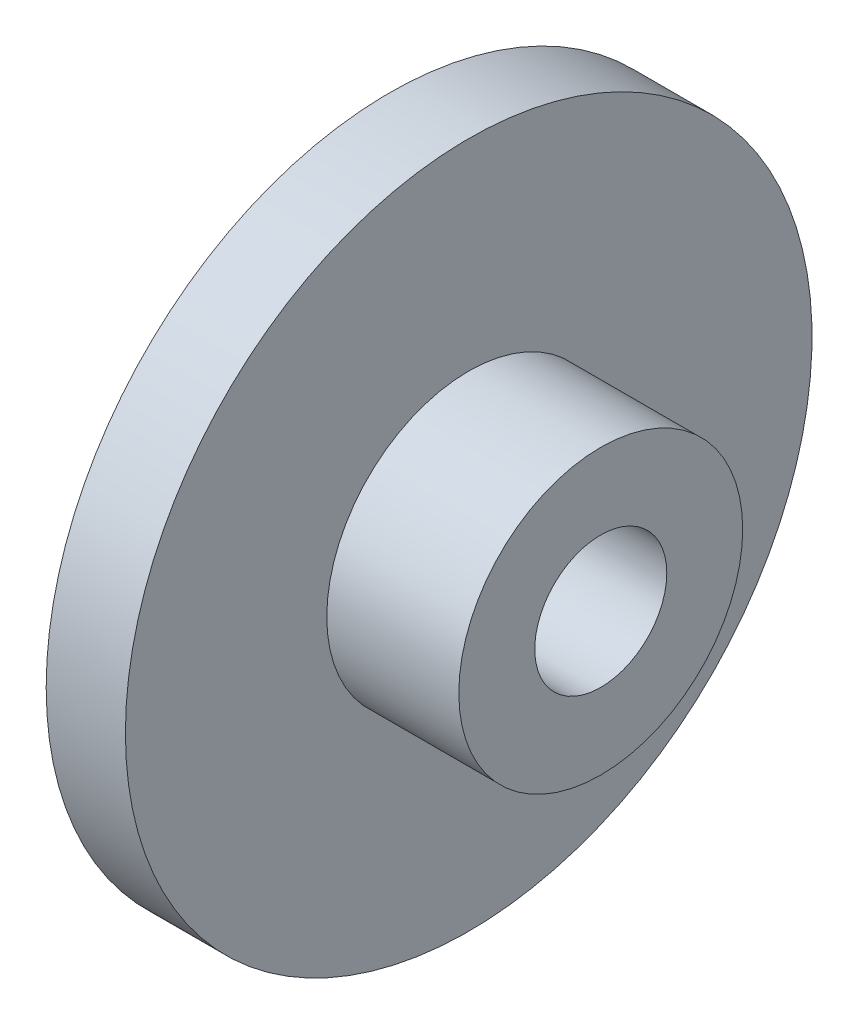
ISO-10303-21;
HEADER;
FILE_DESCRIPTION(('STEP AP214'),'2;1');
FILE_NAME('part.step','',(''),(''),'','','');
FILE_SCHEMA(('AUTOMOTIVE_DESIGN { 1 0 10303 214 1 1 1 1 }'));
ENDSEC;
DATA;
#1=APPLICATION_CONTEXT('core data for automotive mechanical design processes');
#2=APPLICATION_PROTOCOL_DEFINITION('international standard','automotive_design',2000,#1);
#3=PRODUCT_CONTEXT('',#1,'mechanical');
#4=PRODUCT('Part','Part','',(#3));
#5=PRODUCT_RELATED_PRODUCT_CATEGORY('part','',(#4));
#6=PRODUCT_DEFINITION_FORMATION('','',#4);
#7=PRODUCT_DEFINITION_CONTEXT('part definition',#1,'design');
#8=PRODUCT_DEFINITION('design','',#6,#7);
#9=PRODUCT_DEFINITION_SHAPE('','',#8);
#10=(LENGTH_UNIT() NAMED_UNIT(*) SI_UNIT(.MILLI.,.METRE.));
#11=(NAMED_UNIT(*) PLANE_ANGLE_UNIT() SI_UNIT($,.RADIAN.));
#12=(NAMED_UNIT(*) SI_UNIT($,.STERADIAN.) SOLID_ANGLE_UNIT());
#13=UNCERTAINTY_MEASURE_WITH_UNIT(LENGTH_MEASURE(1.E-05),#10,'distance_accuracy_value','');
#14=(GEOMETRIC_REPRESENTATION_CONTEXT(3) GLOBAL_UNCERTAINTY_ASSIGNED_CONTEXT((#13)) GLOBAL_UNIT_ASSIGNED_CONTEXT((#10,
#11,#12)) REPRESENTATION_CONTEXT('',''));
#15=CARTESIAN_POINT('',(0.,0.,0.));
#16=DIRECTION('',(0.,0.,1.));
#17=DIRECTION('',(1.,0.,0.));
#18=AXIS2_PLACEMENT_3D('',#15,#16,#17);
#19=CARTESIAN_POINT('',(4.7625,0.,0.));
#20=DIRECTION('',(1.,0.,0.));
#21=DIRECTION('',(0.,0.,-1.));
#22=AXIS2_PLACEMENT_3D('',#19,#20,#21);
#23=PLANE('',#22);
#24=CARTESIAN_POINT('',(4.7625,0.,0.));
#25=DIRECTION('',(1.,0.,0.));
#26=DIRECTION('',(0.,0.,-1.));
#27=AXIS2_PLACEMENT_3D('',#24,#25,#26);
#28=CIRCLE('',#27,20.6375);
#29=CARTESIAN_POINT('',(4.7625,0.,20.6375));
#30=VERTEX_POINT('',#29);
#31=EDGE_CURVE('E10',#30,#30,#28,.T.);
#32=ORIENTED_EDGE('',*,*,#31,.T.);
#33=EDGE_LOOP('',(#32));
#34=FACE_BOUND('',#33,.T.);
#35=CARTESIAN_POINT('',(4.7625,0.,0.));
#36=DIRECTION('',(1.,0.,0.));
#37=DIRECTION('',(0.,0.,-1.));
#38=AXIS2_PLACEMENT_3D('',#35,#36,#37);
#39=CIRCLE('',#38,8.5328125);
#40=CARTESIAN_POINT('',(4.7625,0.,-8.5328125));
#41=VERTEX_POINT('',#40);
#42=EDGE_CURVE('E45',#41,#41,#39,.T.);
#43=ORIENTED_EDGE('',*,*,#42,.F.);
#44=EDGE_LOOP('',(#43));
#45=FACE_BOUND('',#44,.T.);
#46=ADVANCED_FACE('F32',(#34,#45),#23,.T.);
#47=CARTESIAN_POINT('',(4.7625,0.,0.));
#48=DIRECTION('',(-1.,0.,0.));
#49=DIRECTION('',(0.,0.,1.));
#50=AXIS2_PLACEMENT_3D('',#47,#48,#49);
#51=CYLINDRICAL_SURFACE('',#50,20.6375);
#52=CARTESIAN_POINT('',(0.,0.,0.));
#53=DIRECTION('',(1.,0.,0.));
#54=DIRECTION('',(0.,0.,-1.));
#55=AXIS2_PLACEMENT_3D('',#52,#53,#54);
#56=CIRCLE('',#55,20.6375);
#57=CARTESIAN_POINT('',(0.,0.,20.6375));
#58=VERTEX_POINT('',#57);
#59=EDGE_CURVE('E36',#58,#58,#56,.T.);
#60=CARTESIAN_POINT('',(4.7625,0.,20.6375));
#61=CARTESIAN_POINT('',(4.712890625,0.,20.6375));
#62=CARTESIAN_POINT('',(4.66328125,0.,20.6375));
#63=CARTESIAN_POINT('',(4.5640625,0.,20.6375));
#64=CARTESIAN_POINT('',(4.514453125,0.,20.6375));
#65=CARTESIAN_POINT('',(4.415234375,0.,20.6375));
#66=CARTESIAN_POINT('',(4.365625,0.,20.6375));
#67=CARTESIAN_POINT('',(4.26640625,0.,20.6375));
#68=CARTESIAN_POINT('',(4.216796875,0.,20.6375));
#69=CARTESIAN_POINT('',(4.117578125,0.,20.6375));
#70=CARTESIAN_POINT('',(4.06796875,0.,20.6375));
#71=CARTESIAN_POINT('',(3.96875,0.,20.6375));
#72=CARTESIAN_POINT('',(3.919140625,0.,20.6375));
#73=CARTESIAN_POINT('',(3.819921875,0.,20.6375));
#74=CARTESIAN_POINT('',(3.7703125,0.,20.6375));
#75=CARTESIAN_POINT('',(3.67109375,0.,20.6375));
#76=CARTESIAN_POINT('',(3.621484375,0.,20.6375));
#77=CARTESIAN_POINT('',(3.522265625,0.,20.6375));
#78=CARTESIAN_POINT('',(3.47265625,0.,20.6375));
#79=CARTESIAN_POINT('',(3.3734375,0.,20.6375));
#80=CARTESIAN_POINT('',(3.323828125,0.,20.6375));
#81=CARTESIAN_POINT('',(3.224609375,0.,20.6375));
#82=CARTESIAN_POINT('',(3.175,0.,20.6375));
#83=CARTESIAN_POINT('',(3.07578125,0.,20.6375));
#84=CARTESIAN_POINT('',(3.026171875,0.,20.6375));
#85=CARTESIAN_POINT('',(2.926953125,0.,20.6375));
#86=CARTESIAN_POINT('',(2.87734375,0.,20.6375));
#87=CARTESIAN_POINT('',(2.778125,0.,20.6375));
#88=CARTESIAN_POINT('',(2.728515625,0.,20.6375));
#89=CARTESIAN_POINT('',(2.629296875,0.,20.6375));
#90=CARTESIAN_POINT('',(2.5796875,0.,20.6375));
#91=CARTESIAN_POINT('',(2.48046875,0.,20.6375));
#92=CARTESIAN_POINT('',(2.430859375,0.,20.6375));
#93=CARTESIAN_POINT('',(2.331640625,0.,20.6375));
#94=CARTESIAN_POINT('',(2.28203125,0.,20.6375));
#95=CARTESIAN_POINT('',(2.1828125,0.,20.6375));
#96=CARTESIAN_POINT('',(2.133203125,0.,20.6375));
#97=CARTESIAN_POINT('',(2.033984375,0.,20.6375));
#98=CARTESIAN_POINT('',(1.984375,0.,20.6375));
#99=CARTESIAN_POINT('',(1.88515625,0.,20.6375));
#100=CARTESIAN_POINT('',(1.835546875,0.,20.6375));
#101=CARTESIAN_POINT('',(1.736328125,0.,20.6375));
#102=CARTESIAN_POINT('',(1.68671875,0.,20.6375));
#103=CARTESIAN_POINT('',(1.5875,0.,20.6375));
#104=CARTESIAN_POINT('',(1.537890625,0.,20.6375));
#105=CARTESIAN_POINT('',(1.438671875,0.,20.6375));
#106=CARTESIAN_POINT('',(1.3890625,0.,20.6375));
#107=CARTESIAN_POINT('',(1.28984375,0.,20.6375));
#108=CARTESIAN_POINT('',(1.240234375,0.,20.6375));
#109=CARTESIAN_POINT('',(1.141015625,0.,20.6375));
#110=CARTESIAN_POINT('',(1.09140625,0.,20.6375));
#111=CARTESIAN_POINT('',(0.9921875,0.,20.6375));
#112=CARTESIAN_POINT('',(0.942578125,0.,20.6375));
#113=CARTESIAN_POINT('',(0.843359375,0.,20.6375));
#114=CARTESIAN_POINT('',(0.79375,0.,20.6375));
#115=CARTESIAN_POINT('',(0.69453125,0.,20.6375));
#116=CARTESIAN_POINT('',(0.644921875,0.,20.6375));
#117=CARTESIAN_POINT('',(0.545703125,0.,20.6375));
#118=CARTESIAN_POINT('',(0.49609375,0.,20.6375));
#119=CARTESIAN_POINT('',(0.396875,0.,20.6375));
#120=CARTESIAN_POINT('',(0.347265625,0.,20.6375));
#121=CARTESIAN_POINT('',(0.248046875,0.,20.6375));
#122=CARTESIAN_POINT('',(0.1984375,0.,20.6375));
#123=CARTESIAN_POINT('',(0.09921875,0.,20.6375));
#124=CARTESIAN_POINT('',(0.049609375,0.,20.6375));
#125=CARTESIAN_POINT('',(0.,0.,20.6375));
#126=B_SPLINE_CURVE_WITH_KNOTS('',3,(#60,#61,#62,#63,#64,#65,#66,#67,#68,#69,#70,#71,#72,#73,
#74,#75,#76,#77,#78,#79,#80,#81,#82,#83,#84,#85,#86,#87,#88,#89,#90,#91,#92,#93,#94,#95,#96,#97,
#98,#99,#100,#101,#102,#103,#104,#105,#106,#107,#108,#109,#110,#111,#112,#113,#114,#115,#116,
#117,#118,#119,#120,#121,#122,#123,#124,#125),.UNSPECIFIED.,.F.,.F.,(4,2,2,2,2,2,2,2,2,2,2,2,2,
2,2,2,2,2,2,2,2,2,2,2,2,2,2,2,2,2,2,2,4),(0.,0.148828124999999,0.297656249999999,
0.446484374999999,0.595312499999999,0.744140625,0.89296875,1.041796875,1.190625,1.339453125,
1.48828125,1.637109375,1.7859375,1.934765625,2.08359375,2.232421875,2.38125,2.530078125,
2.67890625,2.827734375,2.9765625,3.125390625,3.27421875,3.423046875,3.571875,3.720703125,
3.86953125,4.018359375,4.1671875,4.316015625,4.46484375,4.613671875,4.7625),.UNSPECIFIED.);
#127=EDGE_CURVE('BSEAM34',#30,#58,#126,.T.);
#128=ORIENTED_EDGE('',*,*,#31,.F.);
#129=ORIENTED_EDGE('',*,*,#59,.T.);
#130=ORIENTED_EDGE('',*,*,#127,.T.);
#131=ORIENTED_EDGE('',*,*,#127,.F.);
#132=EDGE_LOOP('',(#128,#130,#129,#131));
#133=FACE_BOUND('',#132,.T.);
#134=ADVANCED_FACE('F34',(#133),#51,.T.);
#135=CARTESIAN_POINT('',(0.,0.,0.));
#136=DIRECTION('',(1.,0.,0.));
#137=DIRECTION('',(0.,0.,-1.));
#138=AXIS2_PLACEMENT_3D('',#135,#136,#137);
#139=PLANE('',#138);
#140=CARTESIAN_POINT('',(0.,0.,0.));
#141=DIRECTION('',(1.,0.,0.));
#142=DIRECTION('',(0.,0.,-1.));
#143=AXIS2_PLACEMENT_3D('',#140,#141,#142);
#144=CIRCLE('',#143,3.96874999999999);
#145=CARTESIAN_POINT('',(0.,0.,-3.96874999999999));
#146=VERTEX_POINT('',#145);
#147=EDGE_CURVE('E48',#146,#146,#144,.T.);
#148=ORIENTED_EDGE('',*,*,#147,.T.);
#149=EDGE_LOOP('',(#148));
#150=FACE_BOUND('',#149,.T.);
#151=ORIENTED_EDGE('',*,*,#59,.F.);
#152=EDGE_LOOP('',(#151));
#153=FACE_BOUND('',#152,.T.);
#154=ADVANCED_FACE('F69',(#150,#153),#139,.F.);
#155=CARTESIAN_POINT('',(12.7,0.,0.));
#156=DIRECTION('',(-1.,0.,0.));
#157=DIRECTION('',(0.,0.,1.));
#158=AXIS2_PLACEMENT_3D('',#155,#156,#157);
#159=CYLINDRICAL_SURFACE('',#158,8.5328125);
#160=CARTESIAN_POINT('',(12.7,0.,0.));
#161=DIRECTION('',(1.,0.,0.));
#162=DIRECTION('',(0.,0.,-1.));
#163=AXIS2_PLACEMENT_3D('',#160,#161,#162);
#164=CIRCLE('',#163,8.5328125);
#165=CARTESIAN_POINT('',(12.7,0.,-8.5328125));
#166=VERTEX_POINT('',#165);
#167=EDGE_CURVE('E43',#166,#166,#164,.T.);
#168=ORIENTED_EDGE('',*,*,#167,.F.);
#169=EDGE_LOOP('',(#168));
#170=FACE_BOUND('',#169,.T.);
#171=ORIENTED_EDGE('',*,*,#42,.T.);
#172=EDGE_LOOP('',(#171));
#173=FACE_BOUND('',#172,.T.);
#174=ADVANCED_FACE('F63',(#170,#173),#159,.T.);
#175=CARTESIAN_POINT('',(12.7,0.,0.));
#176=DIRECTION('',(1.,0.,0.));
#177=DIRECTION('',(0.,0.,-1.));
#178=AXIS2_PLACEMENT_3D('',#175,#176,#177);
#179=PLANE('',#178);
#180=CARTESIAN_POINT('',(12.7,0.,0.));
#181=DIRECTION('',(1.,0.,0.));
#182=DIRECTION('',(0.,0.,-1.));
#183=AXIS2_PLACEMENT_3D('',#180,#181,#182);
#184=CIRCLE('',#183,3.96874999999999);
#185=CARTESIAN_POINT('',(12.7,0.,-3.96874999999999));
#186=VERTEX_POINT('',#185);
#187=EDGE_CURVE('E53',#186,#186,#184,.T.);
#188=ORIENTED_EDGE('',*,*,#187,.F.);
#189=EDGE_LOOP('',(#188));
#190=FACE_BOUND('',#189,.T.);
#191=ORIENTED_EDGE('',*,*,#167,.T.);
#192=EDGE_LOOP('',(#191));
#193=FACE_BOUND('',#192,.T.);
#194=ADVANCED_FACE('F60',(#190,#193),#179,.T.);
#195=CARTESIAN_POINT('',(12.7,0.,0.));
#196=DIRECTION('',(1.,0.,0.));
#197=DIRECTION('',(0.,0.,-1.));
#198=AXIS2_PLACEMENT_3D('',#195,#196,#197);
#199=CYLINDRICAL_SURFACE('',#198,3.96874999999999);
#200=ORIENTED_EDGE('',*,*,#187,.T.);
#201=EDGE_LOOP('',(#200));
#202=FACE_BOUND('',#201,.T.);
#203=ORIENTED_EDGE('',*,*,#147,.F.);
#204=EDGE_LOOP('',(#203));
#205=FACE_BOUND('',#204,.T.);
#206=ADVANCED_FACE('F57',(#202,#205),#199,.F.);
#207=CLOSED_SHELL('',(#46,#134,#154,#174,#194,#206));
#208=MANIFOLD_SOLID_BREP('B2',#207);
#209=ADVANCED_BREP_SHAPE_REPRESENTATION('',(#18,#208),#14);
#210=SHAPE_DEFINITION_REPRESENTATION(#9,#209);
ENDSEC;
END-ISO-10303-21;
